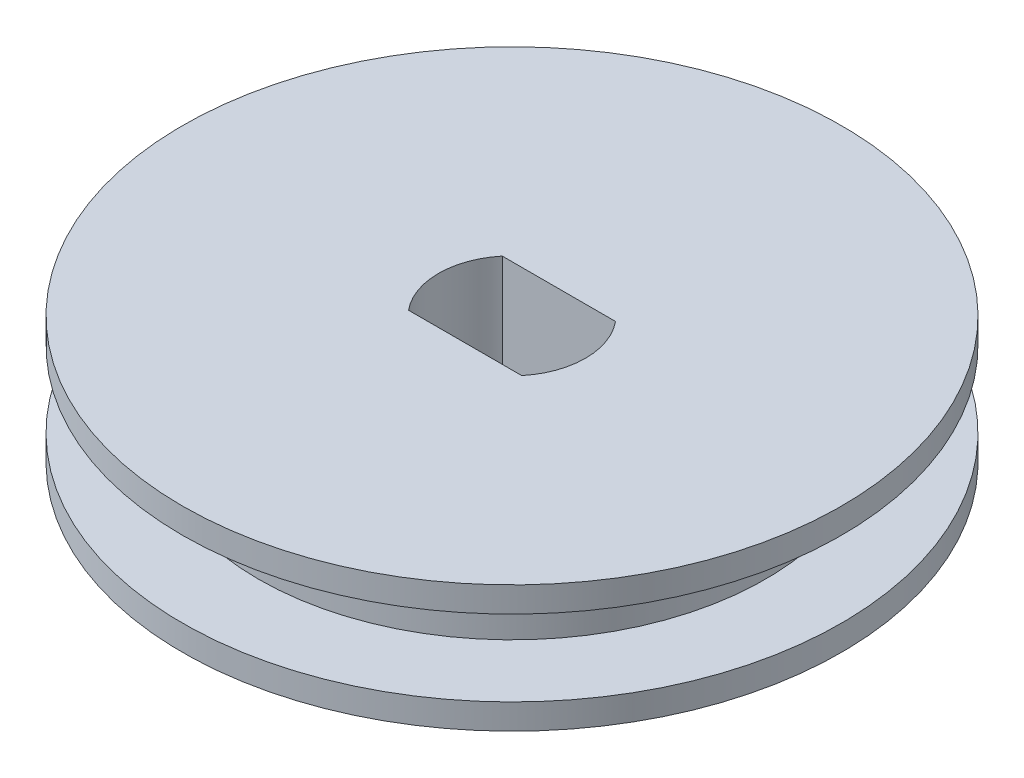
ISO-10303-21;
HEADER;
FILE_DESCRIPTION(('STEP AP214'),'2;1');
FILE_NAME('part.step','',(''),(''),'','','');
FILE_SCHEMA(('AUTOMOTIVE_DESIGN { 1 0 10303 214 1 1 1 1 }'));
ENDSEC;
DATA;
#1=APPLICATION_CONTEXT('core data for automotive mechanical design processes');
#2=APPLICATION_PROTOCOL_DEFINITION('international standard','automotive_design',2000,#1);
#3=PRODUCT_CONTEXT('',#1,'mechanical');
#4=PRODUCT('Part','Part','',(#3));
#5=PRODUCT_RELATED_PRODUCT_CATEGORY('part','',(#4));
#6=PRODUCT_DEFINITION_FORMATION('','',#4);
#7=PRODUCT_DEFINITION_CONTEXT('part definition',#1,'design');
#8=PRODUCT_DEFINITION('design','',#6,#7);
#9=PRODUCT_DEFINITION_SHAPE('','',#8);
#10=(LENGTH_UNIT() NAMED_UNIT(*) SI_UNIT(.MILLI.,.METRE.));
#11=(NAMED_UNIT(*) PLANE_ANGLE_UNIT() SI_UNIT($,.RADIAN.));
#12=(NAMED_UNIT(*) SI_UNIT($,.STERADIAN.) SOLID_ANGLE_UNIT());
#13=UNCERTAINTY_MEASURE_WITH_UNIT(LENGTH_MEASURE(1.E-05),#10,'distance_accuracy_value','');
#14=(GEOMETRIC_REPRESENTATION_CONTEXT(3) GLOBAL_UNCERTAINTY_ASSIGNED_CONTEXT((#13)) GLOBAL_UNIT_ASSIGNED_CONTEXT((#10,
#11,#12)) REPRESENTATION_CONTEXT('',''));
#15=CARTESIAN_POINT('',(0.,0.,0.));
#16=DIRECTION('',(0.,0.,1.));
#17=DIRECTION('',(1.,0.,0.));
#18=AXIS2_PLACEMENT_3D('',#15,#16,#17);
#19=CARTESIAN_POINT('',(0.,5.,0.));
#20=DIRECTION('',(0.,1.,0.));
#21=DIRECTION('',(0.,0.,1.));
#22=AXIS2_PLACEMENT_3D('',#19,#20,#21);
#23=PLANE('',#22);
#24=CARTESIAN_POINT('',(0.,5.,0.));
#25=DIRECTION('',(0.,1.,0.));
#26=DIRECTION('',(0.,0.,1.));
#27=AXIS2_PLACEMENT_3D('',#24,#25,#26);
#28=CIRCLE('',#27,13.);
#29=CARTESIAN_POINT('',(0.,5.,13.));
#30=VERTEX_POINT('',#29);
#31=EDGE_CURVE('E160',#30,#30,#28,.T.);
#32=ORIENTED_EDGE('',*,*,#31,.T.);
#33=EDGE_LOOP('',(#32));
#34=FACE_BOUND('',#33,.T.);
#35=DIRECTION('',(1.,0.,0.));
#36=VECTOR('',#35,1.);
#37=CARTESIAN_POINT('',(-2.23327114341273,5.,1.85));
#38=LINE('',#37,#36);
#39=CARTESIAN_POINT('',(-2.23327114341273,5.,1.85));
#40=VERTEX_POINT('',#39);
#41=CARTESIAN_POINT('',(2.23327114341273,5.,1.85));
#42=VERTEX_POINT('',#41);
#43=EDGE_CURVE('E94',#40,#42,#38,.T.);
#44=ORIENTED_EDGE('',*,*,#43,.F.);
#45=CARTESIAN_POINT('',(0.,5.,0.));
#46=DIRECTION('',(0.,1.,0.));
#47=DIRECTION('',(0.,0.,1.));
#48=AXIS2_PLACEMENT_3D('',#45,#46,#47);
#49=CIRCLE('',#48,2.9);
#50=CARTESIAN_POINT('',(-2.23327114341273,5.,-1.85));
#51=VERTEX_POINT('',#50);
#52=EDGE_CURVE('E85',#51,#40,#49,.T.);
#53=ORIENTED_EDGE('',*,*,#52,.F.);
#54=DIRECTION('',(-1.,0.,0.));
#55=VECTOR('',#54,1.);
#56=CARTESIAN_POINT('',(-2.23327114341273,5.,-1.85));
#57=LINE('',#56,#55);
#58=CARTESIAN_POINT('',(2.23327114341273,5.,-1.85));
#59=VERTEX_POINT('',#58);
#60=EDGE_CURVE('E104',#59,#51,#57,.T.);
#61=ORIENTED_EDGE('',*,*,#60,.F.);
#62=CARTESIAN_POINT('',(0.,5.,0.));
#63=DIRECTION('',(0.,1.,0.));
#64=DIRECTION('',(0.,0.,1.));
#65=AXIS2_PLACEMENT_3D('',#62,#63,#64);
#66=CIRCLE('',#65,2.9);
#67=EDGE_CURVE('E105',#42,#59,#66,.T.);
#68=ORIENTED_EDGE('',*,*,#67,.F.);
#69=EDGE_LOOP('',(#44,#53,#61,#68));
#70=FACE_BOUND('',#69,.T.);
#71=ADVANCED_FACE('F39',(#34,#70),#23,.T.);
#72=CARTESIAN_POINT('',(0.,1.,0.));
#73=DIRECTION('',(0.,-1.,0.));
#74=DIRECTION('',(0.,0.,-1.));
#75=AXIS2_PLACEMENT_3D('',#72,#73,#74);
#76=CYLINDRICAL_SURFACE('',#75,10.);
#77=CARTESIAN_POINT('',(0.,2.08333333333333,10.));
#78=CARTESIAN_POINT('',(-0.0343918405423154,2.08333425663211,10.000000240665));
#79=CARTESIAN_POINT('',(-0.0687684758567977,2.0861353066438,9.99982110138255));
#80=CARTESIAN_POINT('',(-0.135569010645962,2.09724394657777,9.99913505389116));
#81=CARTESIAN_POINT('',(-0.168020537021735,2.10538301783988,9.99863818778998));
#82=CARTESIAN_POINT('',(-0.231067060183103,2.12720450531789,9.99737964295823));
#83=CARTESIAN_POINT('',(-0.261661198327348,2.14088946320878,9.99661784283137));
#84=CARTESIAN_POINT('',(-0.312236604015932,2.16976815300715,9.99514778735229));
#85=CARTESIAN_POINT('',(-0.33294142373761,2.18369867078747,9.99447496513664));
#86=CARTESIAN_POINT('',(-0.371775183435641,2.21471098780811,9.99310554166539));
#87=CARTESIAN_POINT('',(-0.389912193310051,2.23178250843328,9.99240902384209));
#88=CARTESIAN_POINT('',(-0.4203753402847,2.2661606546136,9.99117022602081));
#89=CARTESIAN_POINT('',(-0.433164451824504,2.2830556294888,9.99062040419207));
#90=CARTESIAN_POINT('',(-0.455735418967818,2.31872363295908,9.98961625670732));
#91=CARTESIAN_POINT('',(-0.465523024765485,2.3374929780329,9.98916174898656));
#92=CARTESIAN_POINT('',(-0.481668859599674,2.37658264627405,9.98839634866069));
#93=CARTESIAN_POINT('',(-0.488008736241563,2.39691062478493,9.98808622585579));
#94=CARTESIAN_POINT('',(-0.496846459003755,2.43838761011626,9.98765056295291));
#95=CARTESIAN_POINT('',(-0.499345257692246,2.45953641204231,9.98752497709104));
#96=CARTESIAN_POINT('',(-0.500385448467233,2.50021755888231,9.98747286038402));
#97=CARTESIAN_POINT('',(-0.499228974536417,2.51974310191324,9.98753113173254));
#98=CARTESIAN_POINT('',(-0.493738053044702,2.55836226110593,9.98780407167143));
#99=CARTESIAN_POINT('',(-0.489399162150791,2.57745523484613,9.98801895892837));
#100=CARTESIAN_POINT('',(-0.477658184068855,2.61518272098965,9.98858736152189));
#101=CARTESIAN_POINT('',(-0.470183354655043,2.63379439440587,9.98894415766662));
#102=CARTESIAN_POINT('',(-0.45252870912274,2.66970028250133,9.98975956530344));
#103=CARTESIAN_POINT('',(-0.44234428104563,2.68699218563122,9.99021835016765));
#104=CARTESIAN_POINT('',(-0.405745285949514,2.74014705675745,9.99179687688918));
#105=CARTESIAN_POINT('',(-0.374701149584311,2.77289468327102,9.99303945570862));
#106=CARTESIAN_POINT('',(-0.299886619634873,2.83281396794417,9.99558107901365));
#107=CARTESIAN_POINT('',(-0.254915720505987,2.85845586750062,9.99686152332652));
#108=CARTESIAN_POINT('',(-0.18046443600173,2.8880415091331,9.99840882771903));
#109=CARTESIAN_POINT('',(-0.152684690509806,2.89657346347264,9.99887459497359));
#110=CARTESIAN_POINT('',(-0.0961438458740754,2.90925953874071,9.9995774543495));
#111=CARTESIAN_POINT('',(-0.0673835244557484,2.91341704945838,9.99981472352363));
#112=CARTESIAN_POINT('',(-0.00711778098514762,2.91748743681278,10.0000466676267));
#113=CARTESIAN_POINT('',(0.0244140131158396,2.91701141188902,10.0000191180778));
#114=CARTESIAN_POINT('',(0.086925580565739,2.91088234190938,9.99967096694745));
#115=CARTESIAN_POINT('',(0.11790607218319,2.9052366265679,9.99935078027533));
#116=CARTESIAN_POINT('',(0.179050212529188,2.8886688482167,9.99844453012022));
#117=CARTESIAN_POINT('',(0.209187947092775,2.87765059093245,9.9978536317294));
#118=CARTESIAN_POINT('',(0.266959631641574,2.85042997219707,9.99647765212517));
#119=CARTESIAN_POINT('',(0.294599151563507,2.83423952754763,9.99569301821606));
#120=CARTESIAN_POINT('',(0.344801102596161,2.79797139174013,9.99408360400923));
#121=CARTESIAN_POINT('',(0.367565119319892,2.77817391486409,9.99326379829392));
#122=CARTESIAN_POINT('',(0.40878324453998,2.73451815392962,9.99166260184777));
#123=CARTESIAN_POINT('',(0.4272461968543,2.71066838007943,9.99088113494583));
#124=CARTESIAN_POINT('',(0.454202249192551,2.66678389813031,9.98968610935136));
#125=CARTESIAN_POINT('',(0.464038612566969,2.64756969178821,9.98923094380837));
#126=CARTESIAN_POINT('',(0.480384579635395,2.60778142934186,9.98845823286531));
#127=CARTESIAN_POINT('',(0.48689859456331,2.58720921755421,9.98814050506849));
#128=CARTESIAN_POINT('',(0.496220902956955,2.54511324415106,9.9876817824229));
#129=CARTESIAN_POINT('',(0.499009259738398,2.52358499518311,9.98754173859338));
#130=CARTESIAN_POINT('',(0.500547959897973,2.48038301338825,9.98746477897818));
#131=CARTESIAN_POINT('',(0.49929996119295,2.45870934394183,9.98752777979268));
#132=CARTESIAN_POINT('',(0.493051127600889,2.41787196221799,9.98783803806299));
#133=CARTESIAN_POINT('',(0.488390224154373,2.39865522030574,9.98806859220266));
#134=CARTESIAN_POINT('',(0.475909974059153,2.36128486890633,9.98867100988628));
#135=CARTESIAN_POINT('',(0.468090753724486,2.34313121693511,9.98904286777888));
#136=CARTESIAN_POINT('',(0.449638655615556,2.30830800418748,9.98989035522735));
#137=CARTESIAN_POINT('',(0.439003376864495,2.29163972612941,9.99036607327356));
#138=CARTESIAN_POINT('',(0.415352195885906,2.26007250036448,9.9913775083935));
#139=CARTESIAN_POINT('',(0.402332332735594,2.24517656555487,9.99191332471103));
#140=CARTESIAN_POINT('',(0.357181740926861,2.20026257773197,9.99366687842542));
#141=CARTESIAN_POINT('',(0.321178303409672,2.17407342496594,9.99491590143385));
#142=CARTESIAN_POINT('',(0.236609035095488,2.1277479663363,9.9973056990682));
#143=CARTESIAN_POINT('',(0.186954520614691,2.10968387862658,9.99838166293073));
#144=CARTESIAN_POINT('',(0.0913029487561987,2.08826173191194,9.99968348434067));
#145=CARTESIAN_POINT('',(0.0456380866477496,2.08333210811279,9.99999968063678));
#146=CARTESIAN_POINT('',(0.,2.08333333333333,10.));
#147=B_SPLINE_CURVE_WITH_KNOTS('',3,(#77,#78,#79,#80,#81,#82,#83,#84,#85,#86,#87,#88,#89,#90,
#91,#92,#93,#94,#95,#96,#97,#98,#99,#100,#101,#102,#103,#104,#105,#106,#107,#108,#109,#110,#111,
#112,#113,#114,#115,#116,#117,#118,#119,#120,#121,#122,#123,#124,#125,#126,#127,#128,#129,#130,
#131,#132,#133,#134,#135,#136,#137,#138,#139,#140,#141,#142,#143,#144,#145,#146),.UNSPECIFIED.,
.T.,.F.,(4,2,2,2,2,2,2,2,2,2,2,2,2,2,2,2,2,2,2,2,2,2,2,2,2,2,2,2,2,2,2,2,2,2,4),(0.,
0.103027550230008,0.20294972268587,0.302917741267874,0.377528323509331,0.451898957763233,
0.515221738346625,0.578422438085317,0.641956344146566,0.70547449157237,0.763883794710688,
0.822374805313773,0.88230496817815,0.942337797010061,1.07569895444588,1.22868566561374,
1.31558281984909,1.40241258712466,1.49658902217748,1.59063213796291,1.68642459305629,
1.78199791360014,1.8720231859602,1.96186168211153,2.02636832474643,2.09078909452871,
2.15555322928169,2.22029076580467,2.27933111629612,2.33836910575574,2.39745759411088,
2.45664513674715,2.58833820245963,2.74486117403514,2.88157907544309),.UNSPECIFIED.);
#148=CARTESIAN_POINT('',(0.,2.08333333333333,10.));
#149=VERTEX_POINT('',#148);
#150=EDGE_CURVE('E148',#149,#149,#147,.T.);
#151=ORIENTED_EDGE('',*,*,#150,.T.);
#152=EDGE_LOOP('',(#151));
#153=FACE_BOUND('',#152,.T.);
#154=CARTESIAN_POINT('',(0.,4.,0.));
#155=DIRECTION('',(0.,1.,0.));
#156=DIRECTION('',(0.,0.,1.));
#157=AXIS2_PLACEMENT_3D('',#154,#155,#156);
#158=CIRCLE('',#157,10.);
#159=CARTESIAN_POINT('',(0.,4.,10.));
#160=VERTEX_POINT('',#159);
#161=EDGE_CURVE('E48',#160,#160,#158,.T.);
#162=ORIENTED_EDGE('',*,*,#161,.F.);
#163=EDGE_LOOP('',(#162));
#164=FACE_BOUND('',#163,.T.);
#165=CARTESIAN_POINT('',(0.,1.,0.));
#166=DIRECTION('',(0.,-1.,0.));
#167=DIRECTION('',(0.,0.,-1.));
#168=AXIS2_PLACEMENT_3D('',#165,#166,#167);
#169=CIRCLE('',#168,10.);
#170=CARTESIAN_POINT('',(0.,1.,-10.));
#171=VERTEX_POINT('',#170);
#172=EDGE_CURVE('E11',#171,#171,#169,.T.);
#173=ORIENTED_EDGE('',*,*,#172,.F.);
#174=EDGE_LOOP('',(#173));
#175=FACE_BOUND('',#174,.T.);
#176=ADVANCED_FACE('F41',(#153,#164,#175),#76,.T.);
#177=CARTESIAN_POINT('',(0.,0.,0.));
#178=DIRECTION('',(0.,1.,0.));
#179=DIRECTION('',(0.,0.,1.));
#180=AXIS2_PLACEMENT_3D('',#177,#178,#179);
#181=PLANE('',#180);
#182=DIRECTION('',(1.,0.,0.));
#183=VECTOR('',#182,1.);
#184=CARTESIAN_POINT('',(0.,0.,-1.85));
#185=LINE('',#184,#183);
#186=CARTESIAN_POINT('',(2.23327114341273,-5.99999999987763E-06,-1.85));
#187=VERTEX_POINT('',#186);
#188=CARTESIAN_POINT('',(-2.23327114341273,-5.99999999987763E-06,-1.85));
#189=VERTEX_POINT('',#188);
#190=EDGE_CURVE('E91',#187,#189,#185,.F.);
#191=ORIENTED_EDGE('',*,*,#190,.T.);
#192=CARTESIAN_POINT('',(-2.23327114341273,0.,-1.85));
#193=CARTESIAN_POINT('',(-2.55626359876438,0.,-1.46009203779629));
#194=CARTESIAN_POINT('',(-2.72823077432032,0.,-0.983237937658805));
#195=CARTESIAN_POINT('',(-2.89989472928249,0.,-0.507224649047805));
#196=CARTESIAN_POINT('',(-2.9,0.,0.));
#197=CARTESIAN_POINT('',(-2.90010502088874,0.,0.506020902076236));
#198=CARTESIAN_POINT('',(-2.72823077432032,0.,0.983237937658806));
#199=CARTESIAN_POINT('',(-2.55665927065863,0.,1.45961439313484));
#200=CARTESIAN_POINT('',(-2.23327114341273,0.,1.85));
#201=B_SPLINE_CURVE_WITH_KNOTS('',2,(#192,#193,#194,#195,#196,#197,#198,#199,#200),
.UNSPECIFIED.,.F.,.F.,(3,2,2,2,3),(0.,0.25,0.5,0.75,1.),.UNSPECIFIED.);
#202=CARTESIAN_POINT('',(-2.23327114341273,-5.99999999987763E-06,1.85));
#203=VERTEX_POINT('',#202);
#204=EDGE_CURVE('E107',#189,#203,#201,.T.);
#205=ORIENTED_EDGE('',*,*,#204,.T.);
#206=DIRECTION('',(1.,0.,0.));
#207=VECTOR('',#206,1.);
#208=CARTESIAN_POINT('',(0.,0.,1.85));
#209=LINE('',#208,#207);
#210=CARTESIAN_POINT('',(2.23327114341273,-5.99999999987763E-06,1.85));
#211=VERTEX_POINT('',#210);
#212=EDGE_CURVE('E96',#203,#211,#209,.T.);
#213=ORIENTED_EDGE('',*,*,#212,.T.);
#214=CARTESIAN_POINT('',(2.23327114341273,0.,1.85));
#215=CARTESIAN_POINT('',(2.55626359876424,0.,1.46009203779646));
#216=CARTESIAN_POINT('',(2.72823077432032,0.,0.983237937658806));
#217=CARTESIAN_POINT('',(2.89989472928249,0.,0.507224649048029));
#218=CARTESIAN_POINT('',(2.9,0.,0.));
#219=CARTESIAN_POINT('',(2.90010502088874,0.,-0.506020902076378));
#220=CARTESIAN_POINT('',(2.72823077432032,0.,-0.983237937658806));
#221=CARTESIAN_POINT('',(2.55665927065853,0.,-1.45961439313495));
#222=CARTESIAN_POINT('',(2.23327114341273,0.,-1.85));
#223=B_SPLINE_CURVE_WITH_KNOTS('',2,(#214,#215,#216,#217,#218,#219,#220,#221,#222),
.UNSPECIFIED.,.F.,.F.,(3,2,2,2,3),(0.,0.25,0.5,0.75,1.),.UNSPECIFIED.);
#224=EDGE_CURVE('E195',#211,#187,#223,.T.);
#225=ORIENTED_EDGE('',*,*,#224,.T.);
#226=EDGE_LOOP('',(#191,#205,#213,#225));
#227=FACE_BOUND('',#226,.T.);
#228=CARTESIAN_POINT('',(0.,0.,7.5));
#229=CARTESIAN_POINT('',(0.0462390736429041,0.,7.49999839587241));
#230=CARTESIAN_POINT('',(0.0924864200573148,0.,7.49352512242986));
#231=CARTESIAN_POINT('',(0.163938358161151,0.,7.47320327223953));
#232=CARTESIAN_POINT('',(0.190306154345912,0.,7.46322328178412));
#233=CARTESIAN_POINT('',(0.241023625012842,0.,7.43897105399718));
#234=CARTESIAN_POINT('',(0.265372375023573,0.,7.42469686415015));
#235=CARTESIAN_POINT('',(0.311300918534582,0.,7.39227798951156));
#236=CARTESIAN_POINT('',(0.332883210717633,0.,7.37413683739742));
#237=CARTESIAN_POINT('',(0.372727006191818,0.,7.3344633485154));
#238=CARTESIAN_POINT('',(0.390983935017271,0.,7.31292641522085));
#239=CARTESIAN_POINT('',(0.423608190375306,0.,7.26710778161505));
#240=CARTESIAN_POINT('',(0.437978244536997,0.,7.24282802314293));
#241=CARTESIAN_POINT('',(0.462438922580153,0.,7.19219947906264));
#242=CARTESIAN_POINT('',(0.472529359594631,0.,7.1658506031672));
#243=CARTESIAN_POINT('',(0.488142902140043,0.,7.11183412009712));
#244=CARTESIAN_POINT('',(0.493666230492309,0.,7.08416657732762));
#245=CARTESIAN_POINT('',(0.499989803084719,0.,7.02829535837555));
#246=CARTESIAN_POINT('',(0.500789792613297,0.,7.00009165336208));
#247=CARTESIAN_POINT('',(0.49764442430675,0.,6.94396985498337));
#248=CARTESIAN_POINT('',(0.493702357062373,0.,6.9160515771068));
#249=CARTESIAN_POINT('',(0.481181695838496,0.,6.86123541199565));
#250=CARTESIAN_POINT('',(0.472596923599696,0.,6.8343389356793));
#251=CARTESIAN_POINT('',(0.451038348807179,0.,6.78238846690866));
#252=CARTESIAN_POINT('',(0.438067572294658,0.,6.75733321860301));
#253=CARTESIAN_POINT('',(0.408103099104854,0.,6.70975478341943));
#254=CARTESIAN_POINT('',(0.391109222077886,0.,6.68723171012197));
#255=CARTESIAN_POINT('',(0.353582248667779,0.,6.64535940965521));
#256=CARTESIAN_POINT('',(0.333049328502669,0.,6.62601002455341));
#257=CARTESIAN_POINT('',(0.289025265875134,0.,6.59103199491655));
#258=CARTESIAN_POINT('',(0.265533961591862,0.,6.57540355404893));
#259=CARTESIAN_POINT('',(0.216277533008077,0.,6.54832155528476));
#260=CARTESIAN_POINT('',(0.190513940067303,0.,6.53686521199822));
#261=CARTESIAN_POINT('',(0.13739556953862,0.,6.51842565021313));
#262=CARTESIAN_POINT('',(0.110038791587036,0.,6.51144819337958));
#263=CARTESIAN_POINT('',(0.0545597606639465,0.,6.50219116420192));
#264=CARTESIAN_POINT('',(0.0264380096792795,0.,6.49990858292994));
#265=CARTESIAN_POINT('',(-0.0297895602258084,0.,6.50009703353133));
#266=CARTESIAN_POINT('',(-0.0578953791462292,0.,6.50256806540474));
#267=CARTESIAN_POINT('',(-0.113311113236169,0.,6.51219676607889));
#268=CARTESIAN_POINT('',(-0.140620506261096,0.,6.51935744037505));
#269=CARTESIAN_POINT('',(-0.193614081891374,0.,6.53815264370888));
#270=CARTESIAN_POINT('',(-0.219300303436268,0.,6.54978142461957));
#271=CARTESIAN_POINT('',(-0.268374093085131,0.,6.57719298393516));
#272=CARTESIAN_POINT('',(-0.291760111192628,0.,6.59297853740357));
#273=CARTESIAN_POINT('',(-0.335548724832065,0.,6.62825087731775));
#274=CARTESIAN_POINT('',(-0.355951483547693,0.,6.64773746118376));
#275=CARTESIAN_POINT('',(-0.393196941193438,0.,6.6898603666357));
#276=CARTESIAN_POINT('',(-0.410039462850237,0.,6.71249684496993));
#277=CARTESIAN_POINT('',(-0.439684341593696,0.,6.76027506503056));
#278=CARTESIAN_POINT('',(-0.452486879787,0.,6.78541669438814));
#279=CARTESIAN_POINT('',(-0.473696742983465,0.,6.83751050458682));
#280=CARTESIAN_POINT('',(-0.482101033589213,0.,6.86446392096982));
#281=CARTESIAN_POINT('',(-0.494253977245832,0.,6.91936278137501));
#282=CARTESIAN_POINT('',(-0.498008817888138,0.,6.94730685592098));
#283=CARTESIAN_POINT('',(-0.500777927661379,0.,7.00344847655034));
#284=CARTESIAN_POINT('',(-0.499788905119809,0.,7.03164618507992));
#285=CARTESIAN_POINT('',(-0.493090965958272,0.,7.08747376144188));
#286=CARTESIAN_POINT('',(-0.487382303676313,0.,7.11510365979092));
#287=CARTESIAN_POINT('',(-0.471407037316291,0.,7.16901427276502));
#288=CARTESIAN_POINT('',(-0.461140210756561,0.,7.19529492146403));
#289=CARTESIAN_POINT('',(-0.436340708865529,0.,7.2457583649462));
#290=CARTESIAN_POINT('',(-0.42180822013208,0.,7.26994125143429));
#291=CARTESIAN_POINT('',(-0.38887757399113,0.,7.31554021153062));
#292=CARTESIAN_POINT('',(-0.37047669624999,0.,7.33695432086987));
#293=CARTESIAN_POINT('',(-0.330367758512933,0.,7.37635981191031));
#294=CARTESIAN_POINT('',(-0.308664252061271,0.,7.39435583070094));
#295=CARTESIAN_POINT('',(-0.262518930141485,0.,7.42646678815502));
#296=CARTESIAN_POINT('',(-0.238074531600847,0.,7.44057802171259));
#297=CARTESIAN_POINT('',(-0.187194161438021,0.,7.46448912327469));
#298=CARTESIAN_POINT('',(-0.160759256422821,0.,7.47429128129763));
#299=CARTESIAN_POINT('',(-0.0902487003250903,0.,7.49383865999402));
#300=CARTESIAN_POINT('',(-0.045128290201748,0.,7.50000156559224));
#301=CARTESIAN_POINT('',(0.,0.,7.5));
#302=B_SPLINE_CURVE_WITH_KNOTS('',3,(#228,#229,#230,#231,#232,#233,#234,#235,#236,#237,#238,
#239,#240,#241,#242,#243,#244,#245,#246,#247,#248,#249,#250,#251,#252,#253,#254,#255,#256,#257,
#258,#259,#260,#261,#262,#263,#264,#265,#266,#267,#268,#269,#270,#271,#272,#273,#274,#275,#276,
#277,#278,#279,#280,#281,#282,#283,#284,#285,#286,#287,#288,#289,#290,#291,#292,#293,#294,#295,
#296,#297,#298,#299,#300,#301),.UNSPECIFIED.,.T.,.F.,(4,2,2,2,2,2,2,2,2,2,2,2,2,2,2,2,2,2,2,2,2,
2,2,2,2,2,2,2,2,2,2,2,2,2,2,2,4),(0.,0.138209846293362,0.222432968830604,0.306694444533051,
0.390879270263393,0.47517904255985,0.559419502778288,0.643663640928671,0.727903668710718,
0.81214823919323,0.896334384697033,0.980632837208026,1.06487324785223,1.1491174355856,
1.2333574297961,1.31760203385858,1.40179029069316,1.48608663188406,1.57032893101543,
1.65457123014725,1.73886757133833,1.82305582817318,1.90730043225384,1.99154042644632,
2.07578461417624,2.16002502482381,2.24432347745586,2.32850962283766,2.41275419176188,
2.49699422110247,2.58123836260791,2.66547881947231,2.74977871537628,2.83396341749783,
2.91822813461395,3.00244801572705,3.13733770016222),.UNSPECIFIED.);
#303=CARTESIAN_POINT('',(0.,0.,7.5));
#304=VERTEX_POINT('',#303);
#305=EDGE_CURVE('E142',#304,#304,#302,.T.);
#306=ORIENTED_EDGE('',*,*,#305,.T.);
#307=EDGE_LOOP('',(#306));
#308=FACE_BOUND('',#307,.T.);
#309=CARTESIAN_POINT('',(0.,0.,0.));
#310=DIRECTION('',(0.,-1.,0.));
#311=DIRECTION('',(0.,0.,-1.));
#312=AXIS2_PLACEMENT_3D('',#309,#310,#311);
#313=CIRCLE('',#312,13.);
#314=CARTESIAN_POINT('',(0.,0.,-13.));
#315=VERTEX_POINT('',#314);
#316=EDGE_CURVE('E100',#315,#315,#313,.T.);
#317=ORIENTED_EDGE('',*,*,#316,.T.);
#318=EDGE_LOOP('',(#317));
#319=FACE_BOUND('',#318,.T.);
#320=ADVANCED_FACE('F167',(#227,#308,#319),#181,.F.);
#321=CARTESIAN_POINT('',(0.,5.,0.));
#322=DIRECTION('',(0.,-1.,0.));
#323=DIRECTION('',(0.,0.,-1.));
#324=AXIS2_PLACEMENT_3D('',#321,#322,#323);
#325=CYLINDRICAL_SURFACE('',#324,13.);
#326=ORIENTED_EDGE('',*,*,#31,.F.);
#327=EDGE_LOOP('',(#326));
#328=FACE_BOUND('',#327,.T.);
#329=CARTESIAN_POINT('',(0.,4.,0.));
#330=DIRECTION('',(0.,1.,0.));
#331=DIRECTION('',(0.,0.,1.));
#332=AXIS2_PLACEMENT_3D('',#329,#330,#331);
#333=CIRCLE('',#332,13.);
#334=CARTESIAN_POINT('',(0.,4.,13.));
#335=VERTEX_POINT('',#334);
#336=EDGE_CURVE('E150',#335,#335,#333,.T.);
#337=ORIENTED_EDGE('',*,*,#336,.T.);
#338=EDGE_LOOP('',(#337));
#339=FACE_BOUND('',#338,.T.);
#340=ADVANCED_FACE('F170',(#328,#339),#325,.T.);
#341=CARTESIAN_POINT('',(0.,4.,0.));
#342=DIRECTION('',(0.,1.,0.));
#343=DIRECTION('',(0.,0.,1.));
#344=AXIS2_PLACEMENT_3D('',#341,#342,#343);
#345=PLANE('',#344);
#346=ORIENTED_EDGE('',*,*,#161,.T.);
#347=EDGE_LOOP('',(#346));
#348=FACE_BOUND('',#347,.T.);
#349=ORIENTED_EDGE('',*,*,#336,.F.);
#350=EDGE_LOOP('',(#349));
#351=FACE_BOUND('',#350,.T.);
#352=ADVANCED_FACE('F165',(#348,#351),#345,.F.);
#353=CARTESIAN_POINT('',(0.,3.78051215448054,12.0366145853767));
#354=CARTESIAN_POINT('',(0.,-1.1284038755815,6.1459153493022));
#355=CARTESIAN_POINT('',(1.,3.78051215448054,12.0366145853767));
#356=CARTESIAN_POINT('',(1.,-1.1284038755815,6.1459153493022));
#357=CARTESIAN_POINT('',(1.,3.78051215448054,11.0366145853767));
#358=CARTESIAN_POINT('',(1.,-1.1284038755815,5.1459153493022));
#359=CARTESIAN_POINT('',(0.,3.78051215448054,11.0366145853767));
#360=CARTESIAN_POINT('',(0.,-1.1284038755815,5.1459153493022));
#361=CARTESIAN_POINT('',(-1.,3.78051215448054,11.0366145853767));
#362=CARTESIAN_POINT('',(-1.,-1.1284038755815,5.1459153493022));
#363=CARTESIAN_POINT('',(-1.,3.78051215448054,12.0366145853767));
#364=CARTESIAN_POINT('',(-1.,-1.1284038755815,6.1459153493022));
#365=CARTESIAN_POINT('',(0.,3.78051215448054,12.0366145853767));
#366=CARTESIAN_POINT('',(0.,-1.1284038755815,6.1459153493022));
#367=(BOUNDED_SURFACE() B_SPLINE_SURFACE(3,1,((#353,#354),(#355,#356),(#357,#358),(#359,#360),
(#361,#362),(#363,#364),(#365,#366)),.UNSPECIFIED.,.T.,.F.,.F.) B_SPLINE_SURFACE_WITH_KNOTS((4,
3,4),(2,2),(0.,0.5,1.),(0.,1.),
.UNSPECIFIED.) GEOMETRIC_REPRESENTATION_ITEM() RATIONAL_B_SPLINE_SURFACE(((1.,1.),
(0.333333333333333,0.333333333333333),(0.333333333333333,0.333333333333333),(1.,1.),
(0.333333333333333,0.333333333333333),(0.333333333333333,0.333333333333333),(1.,1.))) REPRESENTATION_ITEM('') SURFACE());
#368=CARTESIAN_POINT('',(0.,2.08333333333333,10.));
#369=CARTESIAN_POINT('',(0.,2.06163194444445,9.97395833333333));
#370=CARTESIAN_POINT('',(0.,2.03993055555556,9.94791666666667));
#371=CARTESIAN_POINT('',(0.,1.99652777777778,9.89583333333333));
#372=CARTESIAN_POINT('',(0.,1.97482638888889,9.86979166666667));
#373=CARTESIAN_POINT('',(0.,1.93142361111111,9.81770833333333));
#374=CARTESIAN_POINT('',(0.,1.90972222222222,9.79166666666667));
#375=CARTESIAN_POINT('',(0.,1.86631944444444,9.73958333333333));
#376=CARTESIAN_POINT('',(0.,1.84461805555556,9.71354166666667));
#377=CARTESIAN_POINT('',(0.,1.80121527777778,9.66145833333333));
#378=CARTESIAN_POINT('',(0.,1.77951388888889,9.63541666666667));
#379=CARTESIAN_POINT('',(0.,1.73611111111111,9.58333333333333));
#380=CARTESIAN_POINT('',(0.,1.71440972222222,9.55729166666667));
#381=CARTESIAN_POINT('',(0.,1.67100694444444,9.50520833333333));
#382=CARTESIAN_POINT('',(0.,1.64930555555556,9.47916666666667));
#383=CARTESIAN_POINT('',(0.,1.60590277777778,9.42708333333333));
#384=CARTESIAN_POINT('',(0.,1.58420138888889,9.40104166666667));
#385=CARTESIAN_POINT('',(0.,1.54079861111111,9.34895833333333));
#386=CARTESIAN_POINT('',(0.,1.51909722222222,9.32291666666667));
#387=CARTESIAN_POINT('',(0.,1.47569444444444,9.27083333333333));
#388=CARTESIAN_POINT('',(0.,1.45399305555556,9.24479166666667));
#389=CARTESIAN_POINT('',(0.,1.41059027777778,9.19270833333333));
#390=CARTESIAN_POINT('',(0.,1.38888888888889,9.16666666666667));
#391=CARTESIAN_POINT('',(0.,1.34548611111111,9.11458333333333));
#392=CARTESIAN_POINT('',(0.,1.32378472222222,9.08854166666667));
#393=CARTESIAN_POINT('',(0.,1.28038194444444,9.03645833333333));
#394=CARTESIAN_POINT('',(0.,1.25868055555556,9.01041666666667));
#395=CARTESIAN_POINT('',(0.,1.21527777777778,8.95833333333333));
#396=CARTESIAN_POINT('',(0.,1.19357638888889,8.93229166666667));
#397=CARTESIAN_POINT('',(0.,1.15017361111111,8.88020833333333));
#398=CARTESIAN_POINT('',(0.,1.12847222222222,8.85416666666667));
#399=CARTESIAN_POINT('',(0.,1.08506944444444,8.80208333333333));
#400=CARTESIAN_POINT('',(0.,1.06336805555556,8.77604166666667));
#401=CARTESIAN_POINT('',(0.,1.01996527777778,8.72395833333333));
#402=CARTESIAN_POINT('',(0.,0.998263888888889,8.69791666666667));
#403=CARTESIAN_POINT('',(0.,0.954861111111111,8.64583333333333));
#404=CARTESIAN_POINT('',(0.,0.933159722222222,8.61979166666667));
#405=CARTESIAN_POINT('',(0.,0.889756944444445,8.56770833333333));
#406=CARTESIAN_POINT('',(0.,0.868055555555556,8.54166666666667));
#407=CARTESIAN_POINT('',(0.,0.824652777777778,8.48958333333333));
#408=CARTESIAN_POINT('',(0.,0.802951388888889,8.46354166666667));
#409=CARTESIAN_POINT('',(0.,0.759548611111111,8.41145833333333));
#410=CARTESIAN_POINT('',(0.,0.737847222222222,8.38541666666667));
#411=CARTESIAN_POINT('',(0.,0.694444444444444,8.33333333333333));
#412=CARTESIAN_POINT('',(0.,0.672743055555555,8.30729166666667));
#413=CARTESIAN_POINT('',(0.,0.629340277777778,8.25520833333333));
#414=CARTESIAN_POINT('',(0.,0.607638888888889,8.22916666666667));
#415=CARTESIAN_POINT('',(0.,0.564236111111111,8.17708333333333));
#416=CARTESIAN_POINT('',(0.,0.542534722222222,8.15104166666667));
#417=CARTESIAN_POINT('',(0.,0.499131944444444,8.09895833333333));
#418=CARTESIAN_POINT('',(0.,0.477430555555556,8.07291666666667));
#419=CARTESIAN_POINT('',(0.,0.434027777777778,8.02083333333333));
#420=CARTESIAN_POINT('',(0.,0.412326388888889,7.99479166666667));
#421=CARTESIAN_POINT('',(0.,0.368923611111111,7.94270833333333));
#422=CARTESIAN_POINT('',(0.,0.347222222222221,7.91666666666667));
#423=CARTESIAN_POINT('',(0.,0.303819444444444,7.86458333333333));
#424=CARTESIAN_POINT('',(0.,0.282118055555555,7.83854166666667));
#425=CARTESIAN_POINT('',(0.,0.238715277777778,7.78645833333333));
#426=CARTESIAN_POINT('',(0.,0.217013888888889,7.76041666666666));
#427=CARTESIAN_POINT('',(0.,0.17361111111111,7.70833333333333));
#428=CARTESIAN_POINT('',(0.,0.151909722222222,7.68229166666666));
#429=CARTESIAN_POINT('',(0.,0.108506944444444,7.63020833333333));
#430=CARTESIAN_POINT('',(0.,0.0868055555555554,7.60416666666666));
#431=CARTESIAN_POINT('',(0.,0.0434027777777777,7.55208333333333));
#432=CARTESIAN_POINT('',(0.,0.0217013888888886,7.52604166666666));
#433=CARTESIAN_POINT('',(0.,0.,7.5));
#434=B_SPLINE_CURVE_WITH_KNOTS('',3,(#368,#369,#370,#371,#372,#373,#374,#375,#376,#377,#378,
#379,#380,#381,#382,#383,#384,#385,#386,#387,#388,#389,#390,#391,#392,#393,#394,#395,#396,#397,
#398,#399,#400,#401,#402,#403,#404,#405,#406,#407,#408,#409,#410,#411,#412,#413,#414,#415,#416,
#417,#418,#419,#420,#421,#422,#423,#424,#425,#426,#427,#428,#429,#430,#431,#432,#433),
.UNSPECIFIED.,.F.,.F.,(4,2,2,2,2,2,2,2,2,2,2,2,2,2,2,2,2,2,2,2,2,2,2,2,2,2,2,2,2,2,2,2,4),(0.,
0.101695959321701,0.203391918643403,0.305087877965104,0.406783837286804,0.508479796608507,
0.610175755930208,0.711871715251909,0.81356767457361,0.915263633895312,1.01695959321701,
1.11865555253871,1.22035151186042,1.32204747118212,1.42374343050382,1.52543938982552,
1.62713534914722,1.72883130846892,1.83052726779062,1.93222322711232,2.03391918643403,
2.13561514575573,2.23731110507743,2.33900706439913,2.44070302372083,2.54239898304253,
2.64409494236423,2.74579090168594,2.84748686100764,2.94918282032934,3.05087877965104,
3.15257473897274,3.25427069829444),.UNSPECIFIED.);
#435=EDGE_CURVE('BSEAM134',#149,#304,#434,.T.);
#436=ORIENTED_EDGE('',*,*,#150,.F.);
#437=ORIENTED_EDGE('',*,*,#305,.F.);
#438=ORIENTED_EDGE('',*,*,#435,.T.);
#439=ORIENTED_EDGE('',*,*,#435,.F.);
#440=EDGE_LOOP('',(#436,#438,#437,#439));
#441=FACE_BOUND('',#440,.T.);
#442=ADVANCED_FACE('F134',(#441),#367,.T.);
#443=CARTESIAN_POINT('',(0.,1.,0.));
#444=DIRECTION('',(0.,-1.,0.));
#445=DIRECTION('',(0.,0.,-1.));
#446=AXIS2_PLACEMENT_3D('',#443,#444,#445);
#447=CYLINDRICAL_SURFACE('',#446,13.);
#448=CARTESIAN_POINT('',(0.,1.,0.));
#449=DIRECTION('',(0.,-1.,0.));
#450=DIRECTION('',(0.,0.,-1.));
#451=AXIS2_PLACEMENT_3D('',#448,#449,#450);
#452=CIRCLE('',#451,13.);
#453=CARTESIAN_POINT('',(0.,1.,-13.));
#454=VERTEX_POINT('',#453);
#455=EDGE_CURVE('E157',#454,#454,#452,.T.);
#456=ORIENTED_EDGE('',*,*,#455,.T.);
#457=EDGE_LOOP('',(#456));
#458=FACE_BOUND('',#457,.T.);
#459=ORIENTED_EDGE('',*,*,#316,.F.);
#460=EDGE_LOOP('',(#459));
#461=FACE_BOUND('',#460,.T.);
#462=ADVANCED_FACE('F130',(#458,#461),#447,.T.);
#463=CARTESIAN_POINT('',(0.,1.,0.));
#464=DIRECTION('',(0.,-1.,0.));
#465=DIRECTION('',(0.,0.,-1.));
#466=AXIS2_PLACEMENT_3D('',#463,#464,#465);
#467=PLANE('',#466);
#468=ORIENTED_EDGE('',*,*,#172,.T.);
#469=EDGE_LOOP('',(#468));
#470=FACE_BOUND('',#469,.T.);
#471=ORIENTED_EDGE('',*,*,#455,.F.);
#472=EDGE_LOOP('',(#471));
#473=FACE_BOUND('',#472,.T.);
#474=ADVANCED_FACE('F121',(#470,#473),#467,.F.);
#475=CARTESIAN_POINT('',(0.,5.,0.));
#476=DIRECTION('',(0.,-1.,0.));
#477=DIRECTION('',(0.,0.,-1.));
#478=AXIS2_PLACEMENT_3D('',#475,#476,#477);
#479=CYLINDRICAL_SURFACE('',#478,2.9);
#480=ORIENTED_EDGE('',*,*,#204,.F.);
#481=DIRECTION('',(0.,-1.,0.));
#482=VECTOR('',#481,1.);
#483=CARTESIAN_POINT('',(-2.23327114341273,5.,-1.85));
#484=LINE('',#483,#482);
#485=EDGE_CURVE('E86',#51,#189,#484,.T.);
#486=ORIENTED_EDGE('',*,*,#485,.F.);
#487=ORIENTED_EDGE('',*,*,#52,.T.);
#488=DIRECTION('',(0.,-1.,0.));
#489=VECTOR('',#488,1.);
#490=CARTESIAN_POINT('',(-2.23327114341273,5.,1.85));
#491=LINE('',#490,#489);
#492=EDGE_CURVE('E87',#40,#203,#491,.T.);
#493=ORIENTED_EDGE('',*,*,#492,.T.);
#494=EDGE_LOOP('',(#480,#486,#487,#493));
#495=FACE_BOUND('',#494,.T.);
#496=ADVANCED_FACE('F82',(#495),#479,.F.);
#497=CARTESIAN_POINT('',(-2.23327114341273,5.,1.85));
#498=DIRECTION('',(0.,0.,-1.));
#499=DIRECTION('',(-1.,0.,0.));
#500=AXIS2_PLACEMENT_3D('',#497,#498,#499);
#501=PLANE('',#500);
#502=ORIENTED_EDGE('',*,*,#212,.F.);
#503=ORIENTED_EDGE('',*,*,#492,.F.);
#504=ORIENTED_EDGE('',*,*,#43,.T.);
#505=DIRECTION('',(0.,-1.,0.));
#506=VECTOR('',#505,1.);
#507=CARTESIAN_POINT('',(2.23327114341273,5.,1.85));
#508=LINE('',#507,#506);
#509=EDGE_CURVE('E57',#42,#211,#508,.T.);
#510=ORIENTED_EDGE('',*,*,#509,.T.);
#511=EDGE_LOOP('',(#502,#503,#504,#510));
#512=FACE_BOUND('',#511,.T.);
#513=ADVANCED_FACE('F98',(#512),#501,.T.);
#514=CARTESIAN_POINT('',(0.,5.,0.));
#515=DIRECTION('',(0.,-1.,0.));
#516=DIRECTION('',(0.,0.,-1.));
#517=AXIS2_PLACEMENT_3D('',#514,#515,#516);
#518=CYLINDRICAL_SURFACE('',#517,2.9);
#519=ORIENTED_EDGE('',*,*,#224,.F.);
#520=ORIENTED_EDGE('',*,*,#509,.F.);
#521=ORIENTED_EDGE('',*,*,#67,.T.);
#522=DIRECTION('',(0.,-1.,0.));
#523=VECTOR('',#522,1.);
#524=CARTESIAN_POINT('',(2.23327114341273,5.,-1.85));
#525=LINE('',#524,#523);
#526=EDGE_CURVE('E63',#59,#187,#525,.T.);
#527=ORIENTED_EDGE('',*,*,#526,.T.);
#528=EDGE_LOOP('',(#519,#520,#521,#527));
#529=FACE_BOUND('',#528,.T.);
#530=ADVANCED_FACE('F200',(#529),#518,.F.);
#531=CARTESIAN_POINT('',(-2.23327114341273,5.,-1.85));
#532=DIRECTION('',(0.,0.,1.));
#533=DIRECTION('',(1.,0.,0.));
#534=AXIS2_PLACEMENT_3D('',#531,#532,#533);
#535=PLANE('',#534);
#536=ORIENTED_EDGE('',*,*,#190,.F.);
#537=ORIENTED_EDGE('',*,*,#526,.F.);
#538=ORIENTED_EDGE('',*,*,#60,.T.);
#539=ORIENTED_EDGE('',*,*,#485,.T.);
#540=EDGE_LOOP('',(#536,#537,#538,#539));
#541=FACE_BOUND('',#540,.T.);
#542=ADVANCED_FACE('F212',(#541),#535,.T.);
#543=CLOSED_SHELL('',(#71,#176,#320,#340,#352,#442,#462,#474,#496,#513,#530,#542));
#544=MANIFOLD_SOLID_BREP('B2',#543);
#545=ADVANCED_BREP_SHAPE_REPRESENTATION('',(#18,#544),#14);
#546=SHAPE_DEFINITION_REPRESENTATION(#9,#545);
ENDSEC;
END-ISO-10303-21;
